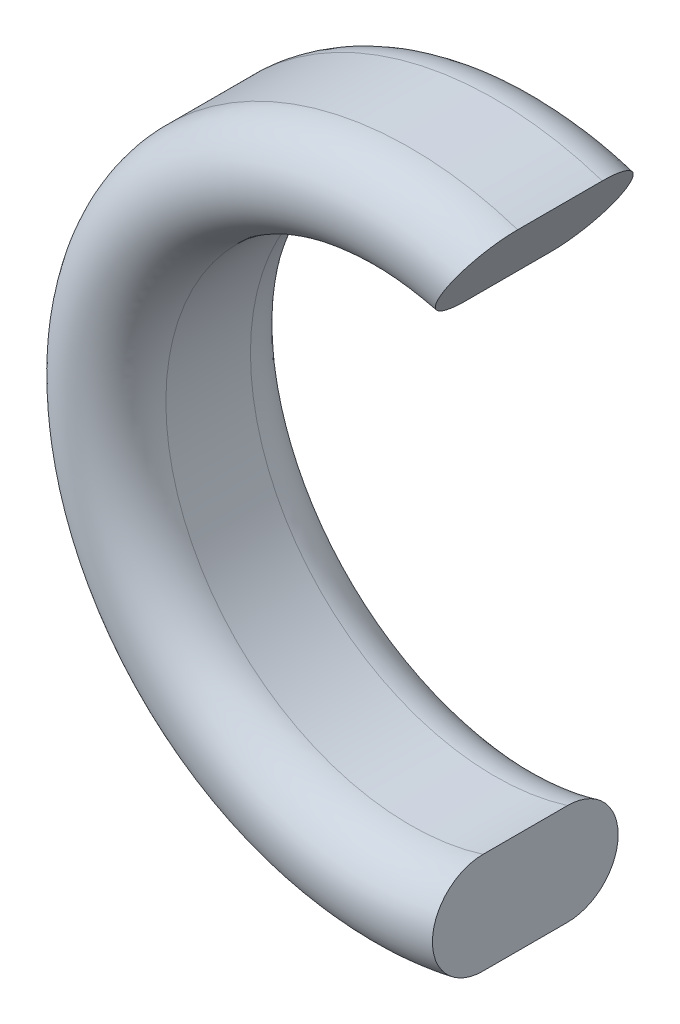
ISO-10303-21;
HEADER;
FILE_DESCRIPTION(('STEP AP214'),'2;1');
FILE_NAME('part.step','',(''),(''),'','','');
FILE_SCHEMA(('AUTOMOTIVE_DESIGN { 1 0 10303 214 1 1 1 1 }'));
ENDSEC;
DATA;
#1=APPLICATION_CONTEXT('core data for automotive mechanical design processes');
#2=APPLICATION_PROTOCOL_DEFINITION('international standard','automotive_design',2000,#1);
#3=PRODUCT_CONTEXT('',#1,'mechanical');
#4=PRODUCT('Part','Part','',(#3));
#5=PRODUCT_RELATED_PRODUCT_CATEGORY('part','',(#4));
#6=PRODUCT_DEFINITION_FORMATION('','',#4);
#7=PRODUCT_DEFINITION_CONTEXT('part definition',#1,'design');
#8=PRODUCT_DEFINITION('design','',#6,#7);
#9=PRODUCT_DEFINITION_SHAPE('','',#8);
#10=(LENGTH_UNIT() NAMED_UNIT(*) SI_UNIT(.MILLI.,.METRE.));
#11=(NAMED_UNIT(*) PLANE_ANGLE_UNIT() SI_UNIT($,.RADIAN.));
#12=(NAMED_UNIT(*) SI_UNIT($,.STERADIAN.) SOLID_ANGLE_UNIT());
#13=UNCERTAINTY_MEASURE_WITH_UNIT(LENGTH_MEASURE(1.E-05),#10,'distance_accuracy_value','');
#14=(GEOMETRIC_REPRESENTATION_CONTEXT(3) GLOBAL_UNCERTAINTY_ASSIGNED_CONTEXT((#13)) GLOBAL_UNIT_ASSIGNED_CONTEXT((#10,
#11,#12)) REPRESENTATION_CONTEXT('',''));
#15=CARTESIAN_POINT('',(0.,0.,0.));
#16=DIRECTION('',(0.,0.,1.));
#17=DIRECTION('',(1.,0.,0.));
#18=AXIS2_PLACEMENT_3D('',#15,#16,#17);
#19=CARTESIAN_POINT('',(0.,0.,6.99665641772294));
#20=DIRECTION('',(1.,0.,0.));
#21=DIRECTION('',(0.,0.,-1.));
#22=AXIS2_PLACEMENT_3D('',#19,#20,#21);
#23=PLANE('',#22);
#24=CARTESIAN_POINT('',(0.,0.,6.99665641772294));
#25=DIRECTION('',(1.,0.,0.));
#26=DIRECTION('',(0.,0.,-1.));
#27=AXIS2_PLACEMENT_3D('',#24,#25,#26);
#28=CIRCLE('',#27,8.36565183996378);
#29=CARTESIAN_POINT('',(0.,8.36565183996378,6.99665641772294));
#30=VERTEX_POINT('',#29);
#31=CARTESIAN_POINT('',(0.,-8.36565183996378,6.99665641772294));
#32=VERTEX_POINT('',#31);
#33=EDGE_CURVE('E78',#30,#32,#28,.T.);
#34=ORIENTED_EDGE('',*,*,#33,.T.);
#35=DIRECTION('',(0.,0.,-1.));
#36=VECTOR('',#35,1.);
#37=CARTESIAN_POINT('',(0.,-8.36565183996378,6.99665641772294));
#38=LINE('',#37,#36);
#39=CARTESIAN_POINT('',(0.,-8.36565183996378,-6.99665641772294));
#40=VERTEX_POINT('',#39);
#41=EDGE_CURVE('E73',#32,#40,#38,.T.);
#42=ORIENTED_EDGE('',*,*,#41,.T.);
#43=CARTESIAN_POINT('',(0.,0.,-6.99665641772294));
#44=DIRECTION('',(1.,0.,0.));
#45=DIRECTION('',(0.,0.,-1.));
#46=AXIS2_PLACEMENT_3D('',#43,#44,#45);
#47=CIRCLE('',#46,8.36565183996378);
#48=CARTESIAN_POINT('',(0.,8.36565183996378,-6.99665641772294));
#49=VERTEX_POINT('',#48);
#50=EDGE_CURVE('E68',#40,#49,#47,.T.);
#51=ORIENTED_EDGE('',*,*,#50,.T.);
#52=DIRECTION('',(0.,0.,1.));
#53=VECTOR('',#52,1.);
#54=CARTESIAN_POINT('',(0.,8.36565183996378,6.99665641772294));
#55=LINE('',#54,#53);
#56=EDGE_CURVE('E85',#49,#30,#55,.T.);
#57=ORIENTED_EDGE('',*,*,#56,.T.);
#58=EDGE_LOOP('',(#34,#42,#51,#57));
#59=FACE_BOUND('',#58,.T.);
#60=ADVANCED_FACE('F33',(#59),#23,.T.);
#61=CARTESIAN_POINT('',(1.48138213321098,93.5203570383993,6.99665641772294));
#62=DIRECTION('',(-0.861035478511977,0.508544889605284,0.));
#63=DIRECTION('',(0.,0.,-1.));
#64=AXIS2_PLACEMENT_3D('',#61,#62,#63);
#65=PLANE('',#64);
#66=CARTESIAN_POINT('',(1.48138213321098,93.5203570383993,6.99665641772294));
#67=DIRECTION('',(-0.861035478511977,0.508544889605284,0.));
#68=DIRECTION('',(0.,0.,-1.));
#69=AXIS2_PLACEMENT_3D('',#66,#67,#68);
#70=CIRCLE('',#69,8.36565183996378);
#71=CARTESIAN_POINT('',(-2.77292735821965,86.3172340033115,6.99665641772294));
#72=VERTEX_POINT('',#71);
#73=CARTESIAN_POINT('',(5.73569162464159,100.723480073487,6.99665641772294));
#74=VERTEX_POINT('',#73);
#75=EDGE_CURVE('E56',#72,#74,#70,.T.);
#76=ORIENTED_EDGE('',*,*,#75,.F.);
#77=DIRECTION('',(0.,0.,1.));
#78=VECTOR('',#77,1.);
#79=CARTESIAN_POINT('',(-2.77292735821964,86.3172340033115,6.99665641772294));
#80=LINE('',#79,#78);
#81=CARTESIAN_POINT('',(-2.77292735821965,86.3172340033115,-6.99665641772294));
#82=VERTEX_POINT('',#81);
#83=EDGE_CURVE('E93',#82,#72,#80,.T.);
#84=ORIENTED_EDGE('',*,*,#83,.F.);
#85=CARTESIAN_POINT('',(1.48138213321098,93.5203570383993,-6.99665641772294));
#86=DIRECTION('',(-0.861035478511977,0.508544889605284,0.));
#87=DIRECTION('',(0.,0.,-1.));
#88=AXIS2_PLACEMENT_3D('',#85,#86,#87);
#89=CIRCLE('',#88,8.36565183996378);
#90=CARTESIAN_POINT('',(5.73569162464159,100.723480073487,-6.99665641772294));
#91=VERTEX_POINT('',#90);
#92=EDGE_CURVE('E11',#91,#82,#89,.T.);
#93=ORIENTED_EDGE('',*,*,#92,.F.);
#94=DIRECTION('',(0.,0.,-1.));
#95=VECTOR('',#94,1.);
#96=CARTESIAN_POINT('',(5.7356916246416,100.723480073487,6.99665641772294));
#97=LINE('',#96,#95);
#98=EDGE_CURVE('E47',#74,#91,#97,.T.);
#99=ORIENTED_EDGE('',*,*,#98,.F.);
#100=EDGE_LOOP('',(#76,#84,#93,#99));
#101=FACE_BOUND('',#100,.T.);
#102=ADVANCED_FACE('F119',(#101),#65,.F.);
#103=CARTESIAN_POINT('',(-12.0369534745846,46.9625790972906,0.));
#104=DIRECTION('',(0.,0.,-1.));
#105=DIRECTION('',(-1.,0.,0.));
#106=AXIS2_PLACEMENT_3D('',#103,#104,#105);
#107=CYLINDRICAL_SURFACE('',#106,40.4303233063587);
#108=CARTESIAN_POINT('',(-12.0369534745846,46.9625790972906,6.99665641772294));
#109=DIRECTION('',(0.,0.,-1.));
#110=DIRECTION('',(0.297720930485152,-0.954652946128097,0.));
#111=AXIS2_PLACEMENT_3D('',#108,#109,#110);
#112=CIRCLE('',#111,40.4303233063587);
#113=EDGE_CURVE('E88',#30,#72,#112,.T.);
#114=ORIENTED_EDGE('',*,*,#113,.F.);
#115=ORIENTED_EDGE('',*,*,#56,.F.);
#116=CARTESIAN_POINT('',(-12.0369534745846,46.9625790972906,-6.99665641772294));
#117=DIRECTION('',(0.,0.,-1.));
#118=DIRECTION('',(0.297720930485152,-0.954652946128097,0.));
#119=AXIS2_PLACEMENT_3D('',#116,#117,#118);
#120=CIRCLE('',#119,40.4303233063587);
#121=EDGE_CURVE('E87',#49,#82,#120,.T.);
#122=ORIENTED_EDGE('',*,*,#121,.T.);
#123=ORIENTED_EDGE('',*,*,#83,.T.);
#124=EDGE_LOOP('',(#114,#115,#122,#123));
#125=FACE_BOUND('',#124,.T.);
#126=ADVANCED_FACE('F86',(#125),#107,.F.);
#127=CARTESIAN_POINT('',(0.,8.36565183996378,6.99665641772294));
#128=CARTESIAN_POINT('',(-27.7187538402972,-0.278801852545807,6.99665641772294));
#129=CARTESIAN_POINT('',(-51.4095130033861,16.5082117108447,6.99665641772294));
#130=CARTESIAN_POINT('',(-52.4417208087223,45.525283257566,6.99665641772294));
#131=CARTESIAN_POINT('',(-53.4739286140586,74.5423548042872,6.99665641772294));
#132=CARTESIAN_POINT('',(-31.035850583611,92.9702832934168,6.99665641772294));
#133=CARTESIAN_POINT('',(-2.77292735821964,86.3172340033115,6.99665641772294));
#134=CARTESIAN_POINT('',(0.,8.36565183996378,23.7279600976505));
#135=CARTESIAN_POINT('',(-27.7187538402972,-0.278801852545805,23.7279600976505));
#136=CARTESIAN_POINT('',(-51.4095130033861,16.5082117108447,23.7279600976505));
#137=CARTESIAN_POINT('',(-52.4417208087223,45.525283257566,23.7279600976505));
#138=CARTESIAN_POINT('',(-53.4739286140586,74.5423548042872,23.7279600976505));
#139=CARTESIAN_POINT('',(-31.035850583611,92.9702832934168,23.7279600976505));
#140=CARTESIAN_POINT('',(-2.77292735821964,86.3172340033115,23.7279600976505));
#141=CARTESIAN_POINT('',(0.,-8.36565183996378,23.7279600976505));
#142=CARTESIAN_POINT('',(-39.7345001985293,-17.0101055324734,23.7279600976505));
#143=CARTESIAN_POINT('',(-70.7163778165184,9.3277065431872,23.7279600976505));
#144=CARTESIAN_POINT('',(-68.5812964028609,49.9355692427423,23.7279600976505));
#145=CARTESIAN_POINT('',(-66.4462149892035,90.5434319422974,23.7279600976505));
#146=CARTESIAN_POINT('',(-32.8732155159886,113.487075768865,23.7279600976505));
#147=CARTESIAN_POINT('',(5.7356916246416,100.723480073487,23.7279600976505));
#148=CARTESIAN_POINT('',(0.,-8.36565183996378,6.99665641772294));
#149=CARTESIAN_POINT('',(-39.7345001985293,-17.0101055324734,6.99665641772294));
#150=CARTESIAN_POINT('',(-70.7163778165184,9.32770654318719,6.99665641772294));
#151=CARTESIAN_POINT('',(-68.581296402861,49.9355692427423,6.99665641772294));
#152=CARTESIAN_POINT('',(-66.4462149892035,90.5434319422974,6.99665641772294));
#153=CARTESIAN_POINT('',(-32.8732155159886,113.487075768865,6.99665641772294));
#154=CARTESIAN_POINT('',(5.7356916246416,100.723480073487,6.99665641772294));
#155=(BOUNDED_SURFACE() B_SPLINE_SURFACE(3,3,((#127,#128,#129,#130,#131,#132,#133),(#134,#135,
#136,#137,#138,#139,#140),(#141,#142,#143,#144,#145,#146,#147),(#148,#149,#150,#151,#152,#153,
#154)),.UNSPECIFIED.,.F.,.F.,.F.) B_SPLINE_SURFACE_WITH_KNOTS((4,4),(4,3,4),(0.,1.),(0.,0.5,1.),
.UNSPECIFIED.) GEOMETRIC_REPRESENTATION_ITEM() RATIONAL_B_SPLINE_SURFACE(((1.,0.737864645137371,
0.737864645137371,1.,0.737864645137371,0.737864645137371,1.),(0.333333333333333,
0.245954881712457,0.245954881712457,0.333333333333333,0.245954881712457,0.245954881712457,
0.333333333333333),(0.333333333333333,0.245954881712457,0.245954881712457,0.333333333333333,
0.245954881712457,0.245954881712457,0.333333333333333),(1.,0.737864645137371,0.737864645137371,
1.,0.737864645137371,0.737864645137371,1.))) REPRESENTATION_ITEM('') SURFACE());
#156=CARTESIAN_POINT('',(-12.0369534745846,46.9625790972906,6.99665641772294));
#157=DIRECTION('',(0.,0.,-1.));
#158=DIRECTION('',(0.212582718185976,-0.977143074441334,0.));
#159=AXIS2_PLACEMENT_3D('',#156,#157,#158);
#160=CIRCLE('',#159,56.6224459697341);
#161=EDGE_CURVE('E100',#32,#74,#160,.T.);
#162=ORIENTED_EDGE('',*,*,#161,.F.);
#163=ORIENTED_EDGE('',*,*,#33,.F.);
#164=ORIENTED_EDGE('',*,*,#113,.T.);
#165=ORIENTED_EDGE('',*,*,#75,.T.);
#166=EDGE_LOOP('',(#162,#163,#164,#165));
#167=FACE_BOUND('',#166,.T.);
#168=ADVANCED_FACE('F106',(#167),#155,.F.);
#169=CARTESIAN_POINT('',(-12.0369534745846,46.9625790972906,0.));
#170=DIRECTION('',(0.,0.,-1.));
#171=DIRECTION('',(-1.,0.,0.));
#172=AXIS2_PLACEMENT_3D('',#169,#170,#171);
#173=CYLINDRICAL_SURFACE('',#172,56.6224459697341);
#174=CARTESIAN_POINT('',(-12.0369534745846,46.9625790972906,-6.99665641772294));
#175=DIRECTION('',(0.,0.,-1.));
#176=DIRECTION('',(0.212582718185976,-0.977143074441334,0.));
#177=AXIS2_PLACEMENT_3D('',#174,#175,#176);
#178=CIRCLE('',#177,56.6224459697341);
#179=EDGE_CURVE('E40',#40,#91,#178,.T.);
#180=ORIENTED_EDGE('',*,*,#179,.F.);
#181=ORIENTED_EDGE('',*,*,#41,.F.);
#182=ORIENTED_EDGE('',*,*,#161,.T.);
#183=ORIENTED_EDGE('',*,*,#98,.T.);
#184=EDGE_LOOP('',(#180,#181,#182,#183));
#185=FACE_BOUND('',#184,.T.);
#186=ADVANCED_FACE('F104',(#185),#173,.T.);
#187=CARTESIAN_POINT('',(0.,-8.36565183996378,-6.99665641772294));
#188=CARTESIAN_POINT('',(-39.7345001985293,-17.0101055324734,-6.99665641772294));
#189=CARTESIAN_POINT('',(-70.7163778165184,9.32770654318719,-6.99665641772294));
#190=CARTESIAN_POINT('',(-68.581296402861,49.9355692427423,-6.99665641772294));
#191=CARTESIAN_POINT('',(-66.4462149892035,90.5434319422974,-6.99665641772294));
#192=CARTESIAN_POINT('',(-32.8732155159886,113.487075768865,-6.99665641772294));
#193=CARTESIAN_POINT('',(5.7356916246416,100.723480073487,-6.99665641772294));
#194=CARTESIAN_POINT('',(0.,-8.36565183996378,-23.7279600976505));
#195=CARTESIAN_POINT('',(-39.7345001985293,-17.0101055324734,-23.7279600976505));
#196=CARTESIAN_POINT('',(-70.7163778165184,9.32770654318719,-23.7279600976505));
#197=CARTESIAN_POINT('',(-68.581296402861,49.9355692427423,-23.7279600976505));
#198=CARTESIAN_POINT('',(-66.4462149892035,90.5434319422975,-23.7279600976505));
#199=CARTESIAN_POINT('',(-32.8732155159886,113.487075768865,-23.7279600976505));
#200=CARTESIAN_POINT('',(5.7356916246416,100.723480073487,-23.7279600976505));
#201=CARTESIAN_POINT('',(0.,8.36565183996378,-23.7279600976505));
#202=CARTESIAN_POINT('',(-27.7187538402972,-0.278801852545807,-23.7279600976505));
#203=CARTESIAN_POINT('',(-51.4095130033861,16.5082117108447,-23.7279600976505));
#204=CARTESIAN_POINT('',(-52.4417208087223,45.525283257566,-23.7279600976505));
#205=CARTESIAN_POINT('',(-53.4739286140586,74.5423548042872,-23.7279600976505));
#206=CARTESIAN_POINT('',(-31.035850583611,92.9702832934168,-23.7279600976505));
#207=CARTESIAN_POINT('',(-2.77292735821964,86.3172340033115,-23.7279600976505));
#208=CARTESIAN_POINT('',(0.,8.36565183996378,-6.99665641772294));
#209=CARTESIAN_POINT('',(-27.7187538402972,-0.278801852545805,-6.99665641772294));
#210=CARTESIAN_POINT('',(-51.4095130033861,16.5082117108447,-6.99665641772294));
#211=CARTESIAN_POINT('',(-52.4417208087223,45.525283257566,-6.99665641772294));
#212=CARTESIAN_POINT('',(-53.4739286140586,74.5423548042872,-6.99665641772294));
#213=CARTESIAN_POINT('',(-31.035850583611,92.9702832934168,-6.99665641772294));
#214=CARTESIAN_POINT('',(-2.77292735821964,86.3172340033115,-6.99665641772294));
#215=(BOUNDED_SURFACE() B_SPLINE_SURFACE(3,3,((#187,#188,#189,#190,#191,#192,#193),(#194,#195,
#196,#197,#198,#199,#200),(#201,#202,#203,#204,#205,#206,#207),(#208,#209,#210,#211,#212,#213,
#214)),.UNSPECIFIED.,.F.,.F.,.F.) B_SPLINE_SURFACE_WITH_KNOTS((4,4),(4,3,4),(0.,1.),(0.,0.5,1.),
.UNSPECIFIED.) GEOMETRIC_REPRESENTATION_ITEM() RATIONAL_B_SPLINE_SURFACE(((1.,0.737864645137371,
0.737864645137371,1.,0.737864645137371,0.737864645137371,1.),(0.333333333333333,
0.245954881712457,0.245954881712457,0.333333333333333,0.245954881712457,0.245954881712457,
0.333333333333333),(0.333333333333333,0.245954881712457,0.245954881712457,0.333333333333333,
0.245954881712457,0.245954881712457,0.333333333333333),(1.,0.737864645137371,0.737864645137371,
1.,0.737864645137371,0.737864645137371,1.))) REPRESENTATION_ITEM('') SURFACE());
#216=ORIENTED_EDGE('',*,*,#92,.T.);
#217=ORIENTED_EDGE('',*,*,#121,.F.);
#218=ORIENTED_EDGE('',*,*,#50,.F.);
#219=ORIENTED_EDGE('',*,*,#179,.T.);
#220=EDGE_LOOP('',(#216,#217,#218,#219));
#221=FACE_BOUND('',#220,.T.);
#222=ADVANCED_FACE('F91',(#221),#215,.F.);
#223=CLOSED_SHELL('',(#60,#102,#126,#168,#186,#222));
#224=MANIFOLD_SOLID_BREP('B2',#223);
#225=ADVANCED_BREP_SHAPE_REPRESENTATION('',(#18,#224),#14);
#226=SHAPE_DEFINITION_REPRESENTATION(#9,#225);
ENDSEC;
END-ISO-10303-21;
